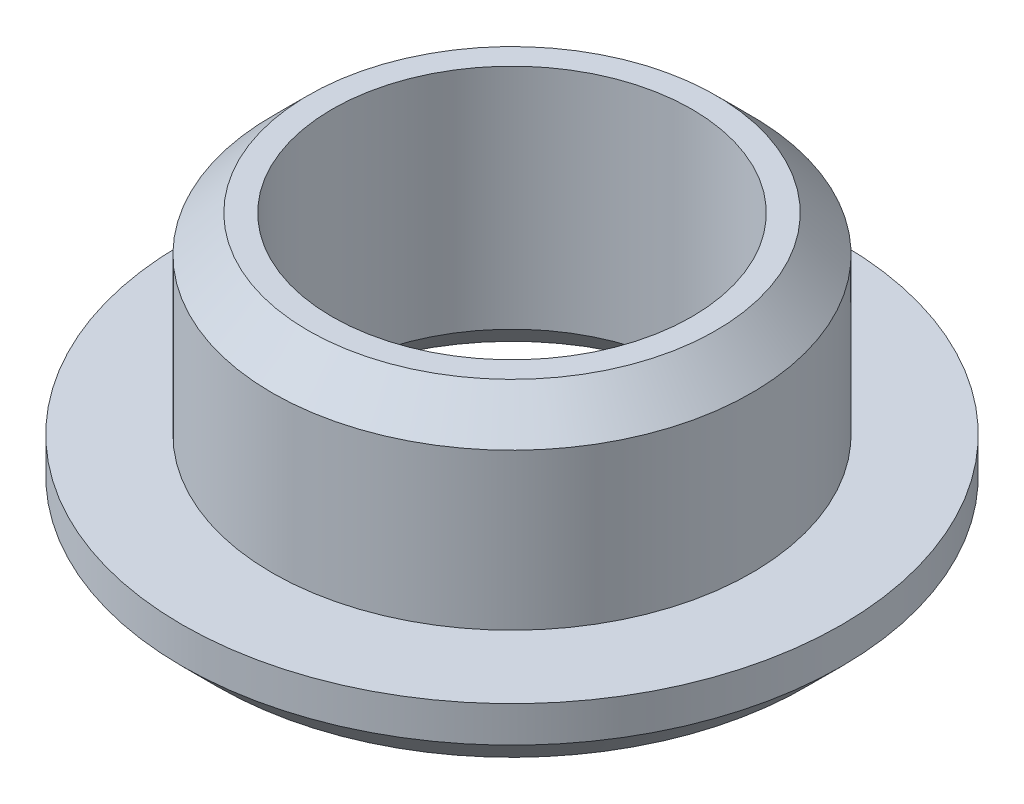
ISO-10303-21;
HEADER;
FILE_DESCRIPTION(('STEP AP214'),'2;1');
FILE_NAME('part.step','',(''),(''),'','','');
FILE_SCHEMA(('AUTOMOTIVE_DESIGN { 1 0 10303 214 1 1 1 1 }'));
ENDSEC;
DATA;
#1=APPLICATION_CONTEXT('core data for automotive mechanical design processes');
#2=APPLICATION_PROTOCOL_DEFINITION('international standard','automotive_design',2000,#1);
#3=PRODUCT_CONTEXT('',#1,'mechanical');
#4=PRODUCT('Part','Part','',(#3));
#5=PRODUCT_RELATED_PRODUCT_CATEGORY('part','',(#4));
#6=PRODUCT_DEFINITION_FORMATION('','',#4);
#7=PRODUCT_DEFINITION_CONTEXT('part definition',#1,'design');
#8=PRODUCT_DEFINITION('design','',#6,#7);
#9=PRODUCT_DEFINITION_SHAPE('','',#8);
#10=(LENGTH_UNIT() NAMED_UNIT(*) SI_UNIT(.MILLI.,.METRE.));
#11=(NAMED_UNIT(*) PLANE_ANGLE_UNIT() SI_UNIT($,.RADIAN.));
#12=(NAMED_UNIT(*) SI_UNIT($,.STERADIAN.) SOLID_ANGLE_UNIT());
#13=UNCERTAINTY_MEASURE_WITH_UNIT(LENGTH_MEASURE(1.E-05),#10,'distance_accuracy_value','');
#14=(GEOMETRIC_REPRESENTATION_CONTEXT(3) GLOBAL_UNCERTAINTY_ASSIGNED_CONTEXT((#13)) GLOBAL_UNIT_ASSIGNED_CONTEXT((#10,
#11,#12)) REPRESENTATION_CONTEXT('',''));
#15=CARTESIAN_POINT('',(0.,0.,0.));
#16=DIRECTION('',(0.,0.,1.));
#17=DIRECTION('',(1.,0.,0.));
#18=AXIS2_PLACEMENT_3D('',#15,#16,#17);
#19=CARTESIAN_POINT('',(0.,8.,0.));
#20=DIRECTION('',(0.,1.,0.));
#21=DIRECTION('',(0.,0.,1.));
#22=AXIS2_PLACEMENT_3D('',#19,#20,#21);
#23=PLANE('',#22);
#24=CARTESIAN_POINT('',(0.,8.,0.));
#25=DIRECTION('',(0.,1.,0.));
#26=DIRECTION('',(0.,0.,1.));
#27=AXIS2_PLACEMENT_3D('',#24,#25,#26);
#28=CIRCLE('',#27,8.50000000000001);
#29=CARTESIAN_POINT('',(0.,8.,8.50000000000001));
#30=VERTEX_POINT('',#29);
#31=EDGE_CURVE('E53',#30,#30,#28,.T.);
#32=ORIENTED_EDGE('',*,*,#31,.T.);
#33=EDGE_LOOP('',(#32));
#34=FACE_BOUND('',#33,.T.);
#35=CARTESIAN_POINT('',(0.,8.,0.));
#36=DIRECTION('',(0.,1.,0.));
#37=DIRECTION('',(0.,0.,1.));
#38=AXIS2_PLACEMENT_3D('',#35,#36,#37);
#39=CIRCLE('',#38,7.5);
#40=CARTESIAN_POINT('',(0.,8.,7.5));
#41=VERTEX_POINT('',#40);
#42=EDGE_CURVE('E68',#41,#41,#39,.T.);
#43=ORIENTED_EDGE('',*,*,#42,.F.);
#44=EDGE_LOOP('',(#43));
#45=FACE_BOUND('',#44,.T.);
#46=ADVANCED_FACE('F41',(#34,#45),#23,.T.);
#47=CARTESIAN_POINT('',(0.,8.,0.));
#48=DIRECTION('',(0.,-1.,0.));
#49=DIRECTION('',(0.,0.,-1.));
#50=AXIS2_PLACEMENT_3D('',#47,#48,#49);
#51=CYLINDRICAL_SURFACE('',#50,10.);
#52=CARTESIAN_POINT('',(0.,6.5,0.));
#53=DIRECTION('',(0.,1.,0.));
#54=DIRECTION('',(0.,0.,1.));
#55=AXIS2_PLACEMENT_3D('',#52,#53,#54);
#56=CIRCLE('',#55,10.);
#57=CARTESIAN_POINT('',(0.,6.5,10.));
#58=VERTEX_POINT('',#57);
#59=EDGE_CURVE('E49',#58,#58,#56,.F.);
#60=ORIENTED_EDGE('',*,*,#59,.T.);
#61=EDGE_LOOP('',(#60));
#62=FACE_BOUND('',#61,.T.);
#63=CARTESIAN_POINT('',(0.,0.,0.));
#64=DIRECTION('',(0.,1.,0.));
#65=DIRECTION('',(0.,0.,1.));
#66=AXIS2_PLACEMENT_3D('',#63,#64,#65);
#67=CIRCLE('',#66,10.);
#68=CARTESIAN_POINT('',(0.,0.,10.));
#69=VERTEX_POINT('',#68);
#70=EDGE_CURVE('E69',#69,#69,#67,.T.);
#71=ORIENTED_EDGE('',*,*,#70,.T.);
#72=EDGE_LOOP('',(#71));
#73=FACE_BOUND('',#72,.T.);
#74=ADVANCED_FACE('F91',(#62,#73),#51,.T.);
#75=CARTESIAN_POINT('',(0.,8.,0.));
#76=DIRECTION('',(0.,-1.,0.));
#77=DIRECTION('',(0.,0.,-1.));
#78=AXIS2_PLACEMENT_3D('',#75,#76,#77);
#79=CYLINDRICAL_SURFACE('',#78,7.5);
#80=CARTESIAN_POINT('',(0.,-1.49999999999999,0.));
#81=DIRECTION('',(0.,1.,0.));
#82=DIRECTION('',(0.,0.,1.));
#83=AXIS2_PLACEMENT_3D('',#80,#81,#82);
#84=CIRCLE('',#83,7.5);
#85=CARTESIAN_POINT('',(0.,-1.49999999999999,7.5));
#86=VERTEX_POINT('',#85);
#87=EDGE_CURVE('E57',#86,#86,#84,.F.);
#88=ORIENTED_EDGE('',*,*,#87,.T.);
#89=EDGE_LOOP('',(#88));
#90=FACE_BOUND('',#89,.T.);
#91=ORIENTED_EDGE('',*,*,#42,.T.);
#92=EDGE_LOOP('',(#91));
#93=FACE_BOUND('',#92,.T.);
#94=ADVANCED_FACE('F83',(#90,#93),#79,.F.);
#95=CARTESIAN_POINT('',(0.,-3.,0.));
#96=DIRECTION('',(0.,1.,0.));
#97=DIRECTION('',(0.,0.,1.));
#98=AXIS2_PLACEMENT_3D('',#95,#96,#97);
#99=CYLINDRICAL_SURFACE('',#98,13.75);
#100=CARTESIAN_POINT('',(0.,-1.50000000000001,0.));
#101=DIRECTION('',(0.,1.,0.));
#102=DIRECTION('',(0.,0.,1.));
#103=AXIS2_PLACEMENT_3D('',#100,#101,#102);
#104=CIRCLE('',#103,13.75);
#105=CARTESIAN_POINT('',(0.,-1.50000000000001,13.75));
#106=VERTEX_POINT('',#105);
#107=EDGE_CURVE('E10',#106,#106,#104,.T.);
#108=ORIENTED_EDGE('',*,*,#107,.T.);
#109=EDGE_LOOP('',(#108));
#110=FACE_BOUND('',#109,.T.);
#111=CARTESIAN_POINT('',(0.,0.,0.));
#112=DIRECTION('',(0.,1.,0.));
#113=DIRECTION('',(0.,0.,1.));
#114=AXIS2_PLACEMENT_3D('',#111,#112,#113);
#115=CIRCLE('',#114,13.75);
#116=CARTESIAN_POINT('',(0.,0.,13.75));
#117=VERTEX_POINT('',#116);
#118=EDGE_CURVE('E72',#117,#117,#115,.T.);
#119=ORIENTED_EDGE('',*,*,#118,.F.);
#120=EDGE_LOOP('',(#119));
#121=FACE_BOUND('',#120,.T.);
#122=ADVANCED_FACE('F80',(#110,#121),#99,.T.);
#123=CARTESIAN_POINT('',(0.,-3.,0.));
#124=DIRECTION('',(0.,1.,0.));
#125=DIRECTION('',(0.,0.,1.));
#126=AXIS2_PLACEMENT_3D('',#123,#124,#125);
#127=PLANE('',#126);
#128=CARTESIAN_POINT('',(0.,-3.,0.));
#129=DIRECTION('',(0.,1.,0.));
#130=DIRECTION('',(0.,0.,1.));
#131=AXIS2_PLACEMENT_3D('',#128,#129,#130);
#132=CIRCLE('',#131,9.);
#133=CARTESIAN_POINT('',(0.,-3.,9.));
#134=VERTEX_POINT('',#133);
#135=EDGE_CURVE('E62',#134,#134,#132,.T.);
#136=ORIENTED_EDGE('',*,*,#135,.T.);
#137=EDGE_LOOP('',(#136));
#138=FACE_BOUND('',#137,.T.);
#139=CARTESIAN_POINT('',(0.,-3.,0.));
#140=DIRECTION('',(0.,1.,0.));
#141=DIRECTION('',(0.,0.,1.));
#142=AXIS2_PLACEMENT_3D('',#139,#140,#141);
#143=CIRCLE('',#142,12.25);
#144=CARTESIAN_POINT('',(0.,-3.,12.25));
#145=VERTEX_POINT('',#144);
#146=EDGE_CURVE('E65',#145,#145,#143,.F.);
#147=ORIENTED_EDGE('',*,*,#146,.T.);
#148=EDGE_LOOP('',(#147));
#149=FACE_BOUND('',#148,.T.);
#150=ADVANCED_FACE('F82',(#138,#149),#127,.F.);
#151=CARTESIAN_POINT('',(0.,0.,0.));
#152=DIRECTION('',(0.,1.,0.));
#153=DIRECTION('',(0.,0.,1.));
#154=AXIS2_PLACEMENT_3D('',#151,#152,#153);
#155=PLANE('',#154);
#156=ORIENTED_EDGE('',*,*,#70,.F.);
#157=EDGE_LOOP('',(#156));
#158=FACE_BOUND('',#157,.T.);
#159=ORIENTED_EDGE('',*,*,#118,.T.);
#160=EDGE_LOOP('',(#159));
#161=FACE_BOUND('',#160,.T.);
#162=ADVANCED_FACE('F78',(#158,#161),#155,.T.);
#163=CARTESIAN_POINT('',(0.,-3.,0.));
#164=DIRECTION('',(0.,-1.,0.));
#165=DIRECTION('',(0.,0.,-1.));
#166=AXIS2_PLACEMENT_3D('',#163,#164,#165);
#167=CONICAL_SURFACE('',#166,9.,0.785398163397447);
#168=ORIENTED_EDGE('',*,*,#87,.F.);
#169=EDGE_LOOP('',(#168));
#170=FACE_BOUND('',#169,.T.);
#171=ORIENTED_EDGE('',*,*,#135,.F.);
#172=EDGE_LOOP('',(#171));
#173=FACE_BOUND('',#172,.T.);
#174=ADVANCED_FACE('F106',(#170,#173),#167,.F.);
#175=CARTESIAN_POINT('',(0.,8.,0.));
#176=DIRECTION('',(0.,-1.,0.));
#177=DIRECTION('',(0.,0.,-1.));
#178=AXIS2_PLACEMENT_3D('',#175,#176,#177);
#179=CONICAL_SURFACE('',#178,8.50000000000001,0.785398163397446);
#180=ORIENTED_EDGE('',*,*,#59,.F.);
#181=EDGE_LOOP('',(#180));
#182=FACE_BOUND('',#181,.T.);
#183=ORIENTED_EDGE('',*,*,#31,.F.);
#184=EDGE_LOOP('',(#183));
#185=FACE_BOUND('',#184,.T.);
#186=ADVANCED_FACE('F111',(#182,#185),#179,.T.);
#187=CARTESIAN_POINT('',(0.,-1.50000000000001,0.));
#188=DIRECTION('',(0.,1.,0.));
#189=DIRECTION('',(0.,0.,1.));
#190=AXIS2_PLACEMENT_3D('',#187,#188,#189);
#191=CONICAL_SURFACE('',#190,13.75,0.785398163397451);
#192=ORIENTED_EDGE('',*,*,#146,.F.);
#193=EDGE_LOOP('',(#192));
#194=FACE_BOUND('',#193,.T.);
#195=ORIENTED_EDGE('',*,*,#107,.F.);
#196=EDGE_LOOP('',(#195));
#197=FACE_BOUND('',#196,.T.);
#198=ADVANCED_FACE('F44',(#194,#197),#191,.T.);
#199=CLOSED_SHELL('',(#46,#74,#94,#122,#150,#162,#174,#186,#198));
#200=MANIFOLD_SOLID_BREP('B2',#199);
#201=ADVANCED_BREP_SHAPE_REPRESENTATION('',(#18,#200),#14);
#202=SHAPE_DEFINITION_REPRESENTATION(#9,#201);
ENDSEC;
END-ISO-10303-21;
